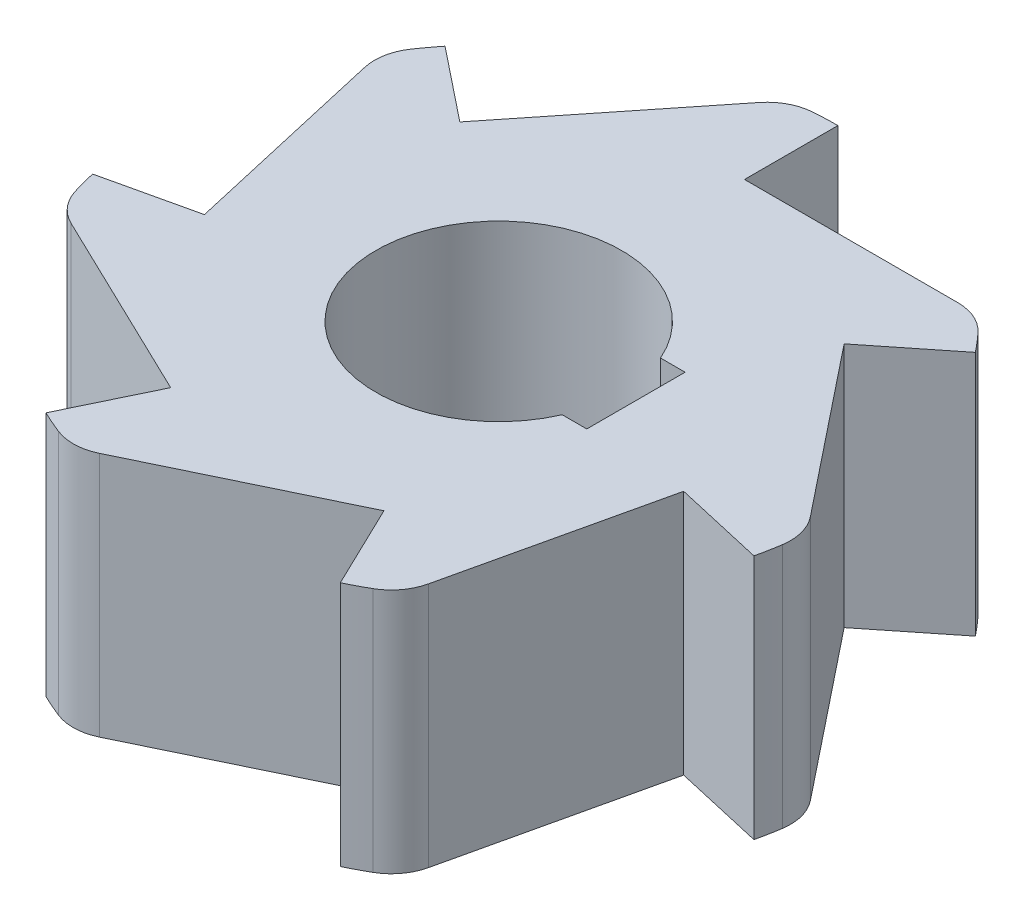
ISO-10303-21;
HEADER;
FILE_DESCRIPTION(('STEP AP214'),'2;1');
FILE_NAME('part.step','',(''),(''),'','','');
FILE_SCHEMA(('AUTOMOTIVE_DESIGN { 1 0 10303 214 1 1 1 1 }'));
ENDSEC;
DATA;
#1=APPLICATION_CONTEXT('core data for automotive mechanical design processes');
#2=APPLICATION_PROTOCOL_DEFINITION('international standard','automotive_design',2000,#1);
#3=PRODUCT_CONTEXT('',#1,'mechanical');
#4=PRODUCT('Part','Part','',(#3));
#5=PRODUCT_RELATED_PRODUCT_CATEGORY('part','',(#4));
#6=PRODUCT_DEFINITION_FORMATION('','',#4);
#7=PRODUCT_DEFINITION_CONTEXT('part definition',#1,'design');
#8=PRODUCT_DEFINITION('design','',#6,#7);
#9=PRODUCT_DEFINITION_SHAPE('','',#8);
#10=(LENGTH_UNIT() NAMED_UNIT(*) SI_UNIT(.MILLI.,.METRE.));
#11=(NAMED_UNIT(*) PLANE_ANGLE_UNIT() SI_UNIT($,.RADIAN.));
#12=(NAMED_UNIT(*) SI_UNIT($,.STERADIAN.) SOLID_ANGLE_UNIT());
#13=UNCERTAINTY_MEASURE_WITH_UNIT(LENGTH_MEASURE(1.E-05),#10,'distance_accuracy_value','');
#14=(GEOMETRIC_REPRESENTATION_CONTEXT(3) GLOBAL_UNCERTAINTY_ASSIGNED_CONTEXT((#13)) GLOBAL_UNIT_ASSIGNED_CONTEXT((#10,
#11,#12)) REPRESENTATION_CONTEXT('',''));
#15=CARTESIAN_POINT('',(0.,0.,0.));
#16=DIRECTION('',(0.,0.,1.));
#17=DIRECTION('',(1.,0.,0.));
#18=AXIS2_PLACEMENT_3D('',#15,#16,#17);
#19=CARTESIAN_POINT('',(21.6941869558779,50.,45.0484433951209));
#20=DIRECTION('',(0.433883739117559,0.,0.900968867902419));
#21=DIRECTION('',(0.900968867902419,0.,-0.433883739117559));
#22=AXIS2_PLACEMENT_3D('',#19,#20,#21);
#23=PLANE('',#22);
#24=DIRECTION('',(-0.900968867902419,0.,0.433883739117559));
#25=VECTOR('',#24,1.);
#26=CARTESIAN_POINT('',(21.6941869558779,0.,45.0484433951209));
#27=LINE('',#26,#25);
#28=CARTESIAN_POINT('',(21.694186955878,0.,45.048443395121));
#29=VERTEX_POINT('',#28);
#30=CARTESIAN_POINT('',(-17.3812805224279,0.,63.8661967507121));
#31=VERTEX_POINT('',#30);
#32=EDGE_CURVE('E306',#29,#31,#27,.T.);
#33=ORIENTED_EDGE('',*,*,#32,.F.);
#34=DIRECTION('',(0.,-1.,0.));
#35=VECTOR('',#34,1.);
#36=CARTESIAN_POINT('',(21.694186955878,50.,45.048443395121));
#37=LINE('',#36,#35);
#38=CARTESIAN_POINT('',(21.694186955878,50.,45.048443395121));
#39=VERTEX_POINT('',#38);
#40=EDGE_CURVE('E11',#39,#29,#37,.T.);
#41=ORIENTED_EDGE('',*,*,#40,.F.);
#42=DIRECTION('',(-0.900968867902419,0.,0.433883739117559));
#43=VECTOR('',#42,1.);
#44=CARTESIAN_POINT('',(21.6941869558779,50.,45.0484433951209));
#45=LINE('',#44,#43);
#46=CARTESIAN_POINT('',(-17.3812805224279,50.,63.8661967507121));
#47=VERTEX_POINT('',#46);
#48=EDGE_CURVE('E519',#39,#47,#45,.T.);
#49=ORIENTED_EDGE('',*,*,#48,.T.);
#50=DIRECTION('',(0.,-1.,0.));
#51=VECTOR('',#50,1.);
#52=CARTESIAN_POINT('',(-17.3812805224279,50.,63.8661967507121));
#53=LINE('',#52,#51);
#54=EDGE_CURVE('E167',#47,#31,#53,.T.);
#55=ORIENTED_EDGE('',*,*,#54,.T.);
#56=EDGE_LOOP('',(#33,#41,#49,#55));
#57=FACE_BOUND('',#56,.T.);
#58=ADVANCED_FACE('F41',(#57),#23,.T.);
#59=CARTESIAN_POINT('',(0.,50.,0.));
#60=DIRECTION('',(-0.900968867902418,0.,0.43388373911756));
#61=DIRECTION('',(0.43388373911756,0.,0.900968867902418));
#62=AXIS2_PLACEMENT_3D('',#59,#60,#61);
#63=PLANE('',#62);
#64=DIRECTION('',(-0.43388373911756,0.,-0.900968867902418));
#65=VECTOR('',#64,1.);
#66=CARTESIAN_POINT('',(0.,0.,0.));
#67=LINE('',#66,#65);
#68=CARTESIAN_POINT('',(29.9379779991117,0.,62.1668518852669));
#69=VERTEX_POINT('',#68);
#70=EDGE_CURVE('E310',#69,#29,#67,.T.);
#71=ORIENTED_EDGE('',*,*,#70,.F.);
#72=DIRECTION('',(0.,-1.,0.));
#73=VECTOR('',#72,1.);
#74=CARTESIAN_POINT('',(29.9379779991117,50.,62.1668518852669));
#75=LINE('',#74,#73);
#76=CARTESIAN_POINT('',(29.9379779991117,50.,62.1668518852669));
#77=VERTEX_POINT('',#76);
#78=EDGE_CURVE('E52',#77,#69,#75,.T.);
#79=ORIENTED_EDGE('',*,*,#78,.F.);
#80=DIRECTION('',(-0.43388373911756,0.,-0.900968867902418));
#81=VECTOR('',#80,1.);
#82=CARTESIAN_POINT('',(0.,50.,0.));
#83=LINE('',#82,#81);
#84=EDGE_CURVE('E529',#77,#39,#83,.T.);
#85=ORIENTED_EDGE('',*,*,#84,.T.);
#86=ORIENTED_EDGE('',*,*,#40,.T.);
#87=EDGE_LOOP('',(#71,#79,#85,#86));
#88=FACE_BOUND('',#87,.T.);
#89=ADVANCED_FACE('F625',(#88),#63,.T.);
#90=CARTESIAN_POINT('',(0.,50.,0.));
#91=DIRECTION('',(0.,-1.,0.));
#92=DIRECTION('',(0.,0.,-1.));
#93=AXIS2_PLACEMENT_3D('',#90,#91,#92);
#94=CYLINDRICAL_SURFACE('',#93,69.);
#95=CARTESIAN_POINT('',(0.,0.,0.));
#96=DIRECTION('',(0.,1.,0.));
#97=DIRECTION('',(0.,0.,1.));
#98=AXIS2_PLACEMENT_3D('',#95,#96,#97);
#99=CIRCLE('',#98,69.);
#100=CARTESIAN_POINT('',(34.3202175931191,0.,59.8591903082639));
#101=VERTEX_POINT('',#100);
#102=EDGE_CURVE('E314',#101,#69,#99,.F.);
#103=ORIENTED_EDGE('',*,*,#102,.F.);
#104=DIRECTION('',(0.,-1.,0.));
#105=VECTOR('',#104,1.);
#106=CARTESIAN_POINT('',(34.3202175931191,50.,59.8591903082639));
#107=LINE('',#106,#105);
#108=CARTESIAN_POINT('',(34.3202175931191,50.,59.8591903082639));
#109=VERTEX_POINT('',#108);
#110=EDGE_CURVE('E484',#109,#101,#107,.T.);
#111=ORIENTED_EDGE('',*,*,#110,.F.);
#112=CARTESIAN_POINT('',(0.,50.,0.));
#113=DIRECTION('',(0.,1.,0.));
#114=DIRECTION('',(0.,0.,1.));
#115=AXIS2_PLACEMENT_3D('',#112,#113,#114);
#116=CIRCLE('',#115,69.);
#117=EDGE_CURVE('E533',#109,#77,#116,.F.);
#118=ORIENTED_EDGE('',*,*,#117,.T.);
#119=ORIENTED_EDGE('',*,*,#78,.T.);
#120=EDGE_LOOP('',(#103,#111,#118,#119));
#121=FACE_BOUND('',#120,.T.);
#122=ADVANCED_FACE('F628',(#121),#94,.T.);
#123=CARTESIAN_POINT('',(29.3462730144062,50.,51.1839453360518));
#124=DIRECTION('',(0.,-1.,0.));
#125=DIRECTION('',(0.,0.,-1.));
#126=AXIS2_PLACEMENT_3D('',#123,#124,#125);
#127=CYLINDRICAL_SURFACE('',#126,10.);
#128=CARTESIAN_POINT('',(29.3462730144062,0.,51.1839453360518));
#129=DIRECTION('',(0.,1.,0.));
#130=DIRECTION('',(0.,0.,1.));
#131=AXIS2_PLACEMENT_3D('',#128,#129,#130);
#132=CIRCLE('',#131,10.);
#133=CARTESIAN_POINT('',(39.0955521362244,0.,53.4091546756149));
#134=VERTEX_POINT('',#133);
#135=EDGE_CURVE('E318',#101,#134,#132,.T.);
#136=ORIENTED_EDGE('',*,*,#135,.T.);
#137=DIRECTION('',(0.,-1.,0.));
#138=VECTOR('',#137,1.);
#139=CARTESIAN_POINT('',(39.0955521362244,50.,53.4091546756149));
#140=LINE('',#139,#138);
#141=CARTESIAN_POINT('',(39.0955521362244,50.,53.4091546756149));
#142=VERTEX_POINT('',#141);
#143=EDGE_CURVE('E481',#142,#134,#140,.T.);
#144=ORIENTED_EDGE('',*,*,#143,.F.);
#145=CARTESIAN_POINT('',(29.3462730144062,50.,51.1839453360518));
#146=DIRECTION('',(0.,1.,0.));
#147=DIRECTION('',(0.,0.,1.));
#148=AXIS2_PLACEMENT_3D('',#145,#146,#147);
#149=CIRCLE('',#148,10.);
#150=EDGE_CURVE('E537',#109,#142,#149,.T.);
#151=ORIENTED_EDGE('',*,*,#150,.F.);
#152=ORIENTED_EDGE('',*,*,#110,.T.);
#153=EDGE_LOOP('',(#136,#144,#151,#152));
#154=FACE_BOUND('',#153,.T.);
#155=ADVANCED_FACE('F634',(#154),#127,.T.);
#156=CARTESIAN_POINT('',(48.7463956090912,50.,11.1260466978157));
#157=DIRECTION('',(0.974927912181824,0.,0.222520933956314));
#158=DIRECTION('',(0.222520933956314,0.,-0.974927912181824));
#159=AXIS2_PLACEMENT_3D('',#156,#157,#158);
#160=PLANE('',#159);
#161=DIRECTION('',(-0.222520933956314,0.,0.974927912181824));
#162=VECTOR('',#161,1.);
#163=CARTESIAN_POINT('',(48.7463956090912,0.,11.1260466978157));
#164=LINE('',#163,#162);
#165=CARTESIAN_POINT('',(48.7463956090912,0.,11.1260466978157));
#166=VERTEX_POINT('',#165);
#167=EDGE_CURVE('E322',#166,#134,#164,.T.);
#168=ORIENTED_EDGE('',*,*,#167,.F.);
#169=DIRECTION('',(0.,-1.,0.));
#170=VECTOR('',#169,1.);
#171=CARTESIAN_POINT('',(48.7463956090912,50.,11.1260466978157));
#172=LINE('',#171,#170);
#173=CARTESIAN_POINT('',(48.7463956090912,50.,11.1260466978157));
#174=VERTEX_POINT('',#173);
#175=EDGE_CURVE('E478',#174,#166,#172,.T.);
#176=ORIENTED_EDGE('',*,*,#175,.F.);
#177=DIRECTION('',(-0.222520933956314,0.,0.974927912181824));
#178=VECTOR('',#177,1.);
#179=CARTESIAN_POINT('',(48.7463956090912,50.,11.1260466978157));
#180=LINE('',#179,#178);
#181=EDGE_CURVE('E540',#174,#142,#180,.T.);
#182=ORIENTED_EDGE('',*,*,#181,.T.);
#183=ORIENTED_EDGE('',*,*,#143,.T.);
#184=EDGE_LOOP('',(#168,#176,#182,#183));
#185=FACE_BOUND('',#184,.T.);
#186=ADVANCED_FACE('F638',(#185),#160,.T.);
#187=CARTESIAN_POINT('',(0.,50.,0.));
#188=DIRECTION('',(-0.222520933956315,0.,0.974927912181824));
#189=DIRECTION('',(0.974927912181824,0.,0.222520933956315));
#190=AXIS2_PLACEMENT_3D('',#187,#188,#189);
#191=PLANE('',#190);
#192=DIRECTION('',(-0.974927912181824,0.,-0.222520933956315));
#193=VECTOR('',#192,1.);
#194=CARTESIAN_POINT('',(0.,0.,0.));
#195=LINE('',#194,#193);
#196=CARTESIAN_POINT('',(67.2700259405458,0.,15.3539444429857));
#197=VERTEX_POINT('',#196);
#198=EDGE_CURVE('E326',#197,#166,#195,.T.);
#199=ORIENTED_EDGE('',*,*,#198,.F.);
#200=DIRECTION('',(0.,-1.,0.));
#201=VECTOR('',#200,1.);
#202=CARTESIAN_POINT('',(67.2700259405458,50.,15.3539444429857));
#203=LINE('',#202,#201);
#204=CARTESIAN_POINT('',(67.2700259405458,50.,15.3539444429857));
#205=VERTEX_POINT('',#204);
#206=EDGE_CURVE('E475',#205,#197,#203,.T.);
#207=ORIENTED_EDGE('',*,*,#206,.F.);
#208=DIRECTION('',(-0.974927912181824,0.,-0.222520933956315));
#209=VECTOR('',#208,1.);
#210=CARTESIAN_POINT('',(0.,50.,0.));
#211=LINE('',#210,#209);
#212=EDGE_CURVE('E544',#205,#174,#211,.T.);
#213=ORIENTED_EDGE('',*,*,#212,.T.);
#214=ORIENTED_EDGE('',*,*,#175,.T.);
#215=EDGE_LOOP('',(#199,#207,#213,#214));
#216=FACE_BOUND('',#215,.T.);
#217=ADVANCED_FACE('F641',(#216),#191,.T.);
#218=CARTESIAN_POINT('',(0.,50.,0.));
#219=DIRECTION('',(0.,-1.,0.));
#220=DIRECTION('',(0.,0.,-1.));
#221=AXIS2_PLACEMENT_3D('',#218,#219,#220);
#222=CYLINDRICAL_SURFACE('',#221,69.);
#223=CARTESIAN_POINT('',(0.,0.,0.));
#224=DIRECTION('',(0.,1.,0.));
#225=DIRECTION('',(0.,0.,1.));
#226=AXIS2_PLACEMENT_3D('',#223,#224,#225);
#227=CIRCLE('',#226,69.);
#228=CARTESIAN_POINT('',(68.1981051649284,0.,10.48896810527));
#229=VERTEX_POINT('',#228);
#230=EDGE_CURVE('E330',#229,#197,#227,.F.);
#231=ORIENTED_EDGE('',*,*,#230,.F.);
#232=DIRECTION('',(0.,-1.,0.));
#233=VECTOR('',#232,1.);
#234=CARTESIAN_POINT('',(68.1981051649284,50.,10.48896810527));
#235=LINE('',#234,#233);
#236=CARTESIAN_POINT('',(68.1981051649284,50.,10.48896810527));
#237=VERTEX_POINT('',#236);
#238=EDGE_CURVE('E472',#237,#229,#235,.T.);
#239=ORIENTED_EDGE('',*,*,#238,.F.);
#240=CARTESIAN_POINT('',(0.,50.,0.));
#241=DIRECTION('',(0.,1.,0.));
#242=DIRECTION('',(0.,0.,1.));
#243=AXIS2_PLACEMENT_3D('',#240,#241,#242);
#244=CIRCLE('',#243,69.);
#245=EDGE_CURVE('E548',#237,#205,#244,.F.);
#246=ORIENTED_EDGE('',*,*,#245,.T.);
#247=ORIENTED_EDGE('',*,*,#206,.T.);
#248=EDGE_LOOP('',(#231,#239,#246,#247));
#249=FACE_BOUND('',#248,.T.);
#250=ADVANCED_FACE('F645',(#249),#222,.T.);
#251=CARTESIAN_POINT('',(58.3143218076924,50.,8.96882780015844));
#252=DIRECTION('',(0.,-1.,0.));
#253=DIRECTION('',(0.,0.,-1.));
#254=AXIS2_PLACEMENT_3D('',#251,#252,#253);
#255=CYLINDRICAL_SURFACE('',#254,10.);
#256=CARTESIAN_POINT('',(58.3143218076924,0.,8.96882780015844));
#257=DIRECTION('',(0.,1.,0.));
#258=DIRECTION('',(0.,0.,1.));
#259=AXIS2_PLACEMENT_3D('',#256,#257,#258);
#260=CIRCLE('',#259,10.);
#261=CARTESIAN_POINT('',(66.1326366323727,0.,2.73392978157109));
#262=VERTEX_POINT('',#261);
#263=EDGE_CURVE('E334',#229,#262,#260,.T.);
#264=ORIENTED_EDGE('',*,*,#263,.T.);
#265=DIRECTION('',(0.,-1.,0.));
#266=VECTOR('',#265,1.);
#267=CARTESIAN_POINT('',(66.1326366323727,50.,2.73392978157109));
#268=LINE('',#267,#266);
#269=CARTESIAN_POINT('',(66.1326366323727,50.,2.73392978157109));
#270=VERTEX_POINT('',#269);
#271=EDGE_CURVE('E469',#270,#262,#268,.T.);
#272=ORIENTED_EDGE('',*,*,#271,.F.);
#273=CARTESIAN_POINT('',(58.3143218076924,50.,8.96882780015844));
#274=DIRECTION('',(0.,1.,0.));
#275=DIRECTION('',(0.,0.,1.));
#276=AXIS2_PLACEMENT_3D('',#273,#274,#275);
#277=CIRCLE('',#276,10.);
#278=EDGE_CURVE('E552',#237,#270,#277,.T.);
#279=ORIENTED_EDGE('',*,*,#278,.F.);
#280=ORIENTED_EDGE('',*,*,#238,.T.);
#281=EDGE_LOOP('',(#264,#272,#279,#280));
#282=FACE_BOUND('',#281,.T.);
#283=ADVANCED_FACE('F650',(#282),#255,.T.);
#284=CARTESIAN_POINT('',(39.0915741234015,50.,-31.1744900929367));
#285=DIRECTION('',(0.78183148246803,0.,-0.623489801858734));
#286=DIRECTION('',(-0.623489801858734,0.,-0.78183148246803));
#287=AXIS2_PLACEMENT_3D('',#284,#285,#286);
#288=PLANE('',#287);
#289=DIRECTION('',(0.623489801858734,0.,0.78183148246803));
#290=VECTOR('',#289,1.);
#291=CARTESIAN_POINT('',(39.0915741234015,0.,-31.1744900929367));
#292=LINE('',#291,#290);
#293=CARTESIAN_POINT('',(39.0915741234015,0.,-31.1744900929367));
#294=VERTEX_POINT('',#293);
#295=EDGE_CURVE('E338',#294,#262,#292,.T.);
#296=ORIENTED_EDGE('',*,*,#295,.F.);
#297=DIRECTION('',(0.,-1.,0.));
#298=VECTOR('',#297,1.);
#299=CARTESIAN_POINT('',(39.0915741234015,50.,-31.1744900929367));
#300=LINE('',#299,#298);
#301=CARTESIAN_POINT('',(39.0915741234015,50.,-31.1744900929367));
#302=VERTEX_POINT('',#301);
#303=EDGE_CURVE('E466',#302,#294,#300,.T.);
#304=ORIENTED_EDGE('',*,*,#303,.F.);
#305=DIRECTION('',(0.623489801858734,0.,0.78183148246803));
#306=VECTOR('',#305,1.);
#307=CARTESIAN_POINT('',(39.0915741234015,50.,-31.1744900929367));
#308=LINE('',#307,#306);
#309=EDGE_CURVE('E555',#302,#270,#308,.T.);
#310=ORIENTED_EDGE('',*,*,#309,.T.);
#311=ORIENTED_EDGE('',*,*,#271,.T.);
#312=EDGE_LOOP('',(#296,#304,#310,#311));
#313=FACE_BOUND('',#312,.T.);
#314=ADVANCED_FACE('F987',(#313),#288,.T.);
#315=CARTESIAN_POINT('',(0.,50.,0.));
#316=DIRECTION('',(0.623489801858733,0.,0.78183148246803));
#317=DIRECTION('',(0.78183148246803,0.,-0.623489801858733));
#318=AXIS2_PLACEMENT_3D('',#315,#316,#317);
#319=PLANE('',#318);
#320=DIRECTION('',(-0.78183148246803,0.,0.623489801858733));
#321=VECTOR('',#320,1.);
#322=CARTESIAN_POINT('',(0.,0.,0.));
#323=LINE('',#322,#321);
#324=CARTESIAN_POINT('',(53.9463722902941,0.,-43.0207963282526));
#325=VERTEX_POINT('',#324);
#326=EDGE_CURVE('E342',#325,#294,#323,.T.);
#327=ORIENTED_EDGE('',*,*,#326,.F.);
#328=DIRECTION('',(0.,-1.,0.));
#329=VECTOR('',#328,1.);
#330=CARTESIAN_POINT('',(53.9463722902941,50.,-43.0207963282526));
#331=LINE('',#330,#329);
#332=CARTESIAN_POINT('',(53.9463722902941,50.,-43.0207963282526));
#333=VERTEX_POINT('',#332);
#334=EDGE_CURVE('E463',#333,#325,#331,.T.);
#335=ORIENTED_EDGE('',*,*,#334,.F.);
#336=DIRECTION('',(-0.78183148246803,0.,0.623489801858733));
#337=VECTOR('',#336,1.);
#338=CARTESIAN_POINT('',(0.,50.,0.));
#339=LINE('',#338,#337);
#340=EDGE_CURVE('E559',#333,#302,#339,.T.);
#341=ORIENTED_EDGE('',*,*,#340,.T.);
#342=ORIENTED_EDGE('',*,*,#303,.T.);
#343=EDGE_LOOP('',(#327,#335,#341,#342));
#344=FACE_BOUND('',#343,.T.);
#345=ADVANCED_FACE('F657',(#344),#319,.T.);
#346=CARTESIAN_POINT('',(0.,50.,0.));
#347=DIRECTION('',(0.,-1.,0.));
#348=DIRECTION('',(0.,0.,-1.));
#349=AXIS2_PLACEMENT_3D('',#346,#347,#348);
#350=CYLINDRICAL_SURFACE('',#349,69.);
#351=CARTESIAN_POINT('',(0.,0.,0.));
#352=DIRECTION('',(0.,1.,0.));
#353=DIRECTION('',(0.,0.,1.));
#354=AXIS2_PLACEMENT_3D('',#351,#352,#353);
#355=CIRCLE('',#354,69.);
#356=CARTESIAN_POINT('',(50.7214285597254,0.,-46.7796610169492));
#357=VERTEX_POINT('',#356);
#358=EDGE_CURVE('E346',#357,#325,#355,.F.);
#359=ORIENTED_EDGE('',*,*,#358,.F.);
#360=DIRECTION('',(0.,-1.,0.));
#361=VECTOR('',#360,1.);
#362=CARTESIAN_POINT('',(50.7214285597254,50.,-46.7796610169492));
#363=LINE('',#362,#361);
#364=CARTESIAN_POINT('',(50.7214285597254,50.,-46.7796610169492));
#365=VERTEX_POINT('',#364);
#366=EDGE_CURVE('E460',#365,#357,#363,.T.);
#367=ORIENTED_EDGE('',*,*,#366,.F.);
#368=CARTESIAN_POINT('',(0.,50.,0.));
#369=DIRECTION('',(0.,1.,0.));
#370=DIRECTION('',(0.,0.,1.));
#371=AXIS2_PLACEMENT_3D('',#368,#369,#370);
#372=CIRCLE('',#371,69.);
#373=EDGE_CURVE('E563',#365,#333,#372,.F.);
#374=ORIENTED_EDGE('',*,*,#373,.T.);
#375=ORIENTED_EDGE('',*,*,#334,.T.);
#376=EDGE_LOOP('',(#359,#367,#374,#375));
#377=FACE_BOUND('',#376,.T.);
#378=ADVANCED_FACE('F661',(#377),#350,.T.);
#379=CARTESIAN_POINT('',(43.3704968844029,50.,-40.));
#380=DIRECTION('',(0.,-1.,0.));
#381=DIRECTION('',(0.,0.,-1.));
#382=AXIS2_PLACEMENT_3D('',#379,#380,#381);
#383=CYLINDRICAL_SURFACE('',#382,10.);
#384=CARTESIAN_POINT('',(43.3704968844029,0.,-40.));
#385=DIRECTION('',(0.,1.,0.));
#386=DIRECTION('',(0.,0.,1.));
#387=AXIS2_PLACEMENT_3D('',#384,#385,#386);
#388=CIRCLE('',#387,10.);
#389=CARTESIAN_POINT('',(43.3704968844029,0.,-50.));
#390=VERTEX_POINT('',#389);
#391=EDGE_CURVE('E350',#357,#390,#388,.T.);
#392=ORIENTED_EDGE('',*,*,#391,.T.);
#393=DIRECTION('',(0.,-1.,0.));
#394=VECTOR('',#393,1.);
#395=CARTESIAN_POINT('',(43.3704968844029,50.,-50.));
#396=LINE('',#395,#394);
#397=CARTESIAN_POINT('',(43.3704968844029,50.,-50.));
#398=VERTEX_POINT('',#397);
#399=EDGE_CURVE('E457',#398,#390,#396,.T.);
#400=ORIENTED_EDGE('',*,*,#399,.F.);
#401=CARTESIAN_POINT('',(43.3704968844029,50.,-40.));
#402=DIRECTION('',(0.,1.,0.));
#403=DIRECTION('',(0.,0.,1.));
#404=AXIS2_PLACEMENT_3D('',#401,#402,#403);
#405=CIRCLE('',#404,10.);
#406=EDGE_CURVE('E567',#365,#398,#405,.T.);
#407=ORIENTED_EDGE('',*,*,#406,.F.);
#408=ORIENTED_EDGE('',*,*,#366,.T.);
#409=EDGE_LOOP('',(#392,#400,#407,#408));
#410=FACE_BOUND('',#409,.T.);
#411=ADVANCED_FACE('F667',(#410),#383,.T.);
#412=CARTESIAN_POINT('',(0.,50.,-50.));
#413=DIRECTION('',(0.,0.,-1.));
#414=DIRECTION('',(-1.,0.,0.));
#415=AXIS2_PLACEMENT_3D('',#412,#413,#414);
#416=PLANE('',#415);
#417=DIRECTION('',(1.,0.,0.));
#418=VECTOR('',#417,1.);
#419=CARTESIAN_POINT('',(0.,0.,-50.));
#420=LINE('',#419,#418);
#421=CARTESIAN_POINT('',(0.,0.,-50.));
#422=VERTEX_POINT('',#421);
#423=EDGE_CURVE('E354',#422,#390,#420,.T.);
#424=ORIENTED_EDGE('',*,*,#423,.F.);
#425=DIRECTION('',(0.,-1.,0.));
#426=VECTOR('',#425,1.);
#427=CARTESIAN_POINT('',(0.,50.,-50.));
#428=LINE('',#427,#426);
#429=CARTESIAN_POINT('',(0.,50.,-50.));
#430=VERTEX_POINT('',#429);
#431=EDGE_CURVE('E454',#430,#422,#428,.T.);
#432=ORIENTED_EDGE('',*,*,#431,.F.);
#433=DIRECTION('',(1.,0.,0.));
#434=VECTOR('',#433,1.);
#435=CARTESIAN_POINT('',(0.,50.,-50.));
#436=LINE('',#435,#434);
#437=EDGE_CURVE('E570',#430,#398,#436,.T.);
#438=ORIENTED_EDGE('',*,*,#437,.T.);
#439=ORIENTED_EDGE('',*,*,#399,.T.);
#440=EDGE_LOOP('',(#424,#432,#438,#439));
#441=FACE_BOUND('',#440,.T.);
#442=ADVANCED_FACE('F671',(#441),#416,.T.);
#443=CARTESIAN_POINT('',(0.,50.,0.));
#444=DIRECTION('',(1.,0.,0.));
#445=DIRECTION('',(0.,0.,-1.));
#446=AXIS2_PLACEMENT_3D('',#443,#444,#445);
#447=PLANE('',#446);
#448=DIRECTION('',(0.,0.,1.));
#449=VECTOR('',#448,1.);
#450=CARTESIAN_POINT('',(0.,0.,0.));
#451=LINE('',#450,#449);
#452=CARTESIAN_POINT('',(-1.85213686511041E-12,0.,-69.));
#453=VERTEX_POINT('',#452);
#454=EDGE_CURVE('E358',#453,#422,#451,.T.);
#455=ORIENTED_EDGE('',*,*,#454,.F.);
#456=DIRECTION('',(0.,-1.,0.));
#457=VECTOR('',#456,1.);
#458=CARTESIAN_POINT('',(-1.85213686511041E-12,50.,-69.));
#459=LINE('',#458,#457);
#460=CARTESIAN_POINT('',(-1.85213686511041E-12,50.,-69.));
#461=VERTEX_POINT('',#460);
#462=EDGE_CURVE('E451',#461,#453,#459,.T.);
#463=ORIENTED_EDGE('',*,*,#462,.F.);
#464=DIRECTION('',(0.,0.,1.));
#465=VECTOR('',#464,1.);
#466=CARTESIAN_POINT('',(0.,50.,0.));
#467=LINE('',#466,#465);
#468=EDGE_CURVE('E574',#461,#430,#467,.T.);
#469=ORIENTED_EDGE('',*,*,#468,.T.);
#470=ORIENTED_EDGE('',*,*,#431,.T.);
#471=EDGE_LOOP('',(#455,#463,#469,#470));
#472=FACE_BOUND('',#471,.T.);
#473=ADVANCED_FACE('F674',(#472),#447,.T.);
#474=CARTESIAN_POINT('',(0.,50.,0.));
#475=DIRECTION('',(0.,-1.,0.));
#476=DIRECTION('',(0.,0.,-1.));
#477=AXIS2_PLACEMENT_3D('',#474,#475,#476);
#478=CYLINDRICAL_SURFACE('',#477,69.);
#479=CARTESIAN_POINT('',(0.,0.,0.));
#480=DIRECTION('',(0.,1.,0.));
#481=DIRECTION('',(0.,0.,1.));
#482=AXIS2_PLACEMENT_3D('',#479,#480,#481);
#483=CIRCLE('',#482,69.);
#484=CARTESIAN_POINT('',(-4.94951827953817,0.,-68.8222512622227));
#485=VERTEX_POINT('',#484);
#486=EDGE_CURVE('E362',#485,#453,#483,.F.);
#487=ORIENTED_EDGE('',*,*,#486,.F.);
#488=DIRECTION('',(0.,-1.,0.));
#489=VECTOR('',#488,1.);
#490=CARTESIAN_POINT('',(-4.94951827953817,50.,-68.8222512622227));
#491=LINE('',#490,#489);
#492=CARTESIAN_POINT('',(-4.94951827953817,50.,-68.8222512622227));
#493=VERTEX_POINT('',#492);
#494=EDGE_CURVE('E448',#493,#485,#491,.T.);
#495=ORIENTED_EDGE('',*,*,#494,.F.);
#496=CARTESIAN_POINT('',(0.,50.,0.));
#497=DIRECTION('',(0.,1.,0.));
#498=DIRECTION('',(0.,0.,1.));
#499=AXIS2_PLACEMENT_3D('',#496,#497,#498);
#500=CIRCLE('',#499,69.);
#501=EDGE_CURVE('E578',#493,#461,#500,.F.);
#502=ORIENTED_EDGE('',*,*,#501,.T.);
#503=ORIENTED_EDGE('',*,*,#462,.T.);
#504=EDGE_LOOP('',(#487,#495,#502,#503));
#505=FACE_BOUND('',#504,.T.);
#506=ADVANCED_FACE('F678',(#505),#478,.T.);
#507=CARTESIAN_POINT('',(-4.23219678975003,50.,-58.8480119488571));
#508=DIRECTION('',(0.,-1.,0.));
#509=DIRECTION('',(0.,0.,-1.));
#510=AXIS2_PLACEMENT_3D('',#507,#508,#509);
#511=CYLINDRICAL_SURFACE('',#510,10.);
#512=CARTESIAN_POINT('',(-4.23219678975003,0.,-58.8480119488571));
#513=DIRECTION('',(0.,1.,0.));
#514=DIRECTION('',(0.,0.,1.));
#515=AXIS2_PLACEMENT_3D('',#512,#513,#514);
#516=CIRCLE('',#515,10.);
#517=CARTESIAN_POINT('',(-12.0505116144303,0.,-65.0829099674445));
#518=VERTEX_POINT('',#517);
#519=EDGE_CURVE('E366',#485,#518,#516,.T.);
#520=ORIENTED_EDGE('',*,*,#519,.T.);
#521=DIRECTION('',(0.,-1.,0.));
#522=VECTOR('',#521,1.);
#523=CARTESIAN_POINT('',(-12.0505116144303,50.,-65.0829099674445));
#524=LINE('',#523,#522);
#525=CARTESIAN_POINT('',(-12.0505116144303,50.,-65.0829099674445));
#526=VERTEX_POINT('',#525);
#527=EDGE_CURVE('E445',#526,#518,#524,.T.);
#528=ORIENTED_EDGE('',*,*,#527,.F.);
#529=CARTESIAN_POINT('',(-4.23219678975003,50.,-58.8480119488571));
#530=DIRECTION('',(0.,1.,0.));
#531=DIRECTION('',(0.,0.,1.));
#532=AXIS2_PLACEMENT_3D('',#529,#530,#531);
#533=CIRCLE('',#532,10.);
#534=EDGE_CURVE('E582',#493,#526,#533,.T.);
#535=ORIENTED_EDGE('',*,*,#534,.F.);
#536=ORIENTED_EDGE('',*,*,#494,.T.);
#537=EDGE_LOOP('',(#520,#528,#535,#536));
#538=FACE_BOUND('',#537,.T.);
#539=ADVANCED_FACE('F683',(#538),#511,.T.);
#540=CARTESIAN_POINT('',(-39.0915741234015,50.,-31.1744900929367));
#541=DIRECTION('',(-0.78183148246803,0.,-0.623489801858733));
#542=DIRECTION('',(-0.623489801858733,0.,0.78183148246803));
#543=AXIS2_PLACEMENT_3D('',#540,#541,#542);
#544=PLANE('',#543);
#545=DIRECTION('',(0.623489801858733,0.,-0.78183148246803));
#546=VECTOR('',#545,1.);
#547=CARTESIAN_POINT('',(-39.0915741234015,0.,-31.1744900929367));
#548=LINE('',#547,#546);
#549=CARTESIAN_POINT('',(-39.0915741234015,0.,-31.1744900929354));
#550=VERTEX_POINT('',#549);
#551=EDGE_CURVE('E370',#550,#518,#548,.T.);
#552=ORIENTED_EDGE('',*,*,#551,.F.);
#553=DIRECTION('',(0.,-1.,0.));
#554=VECTOR('',#553,1.);
#555=CARTESIAN_POINT('',(-39.0915741234015,50.,-31.1744900929354));
#556=LINE('',#555,#554);
#557=CARTESIAN_POINT('',(-39.0915741234015,50.,-31.1744900929354));
#558=VERTEX_POINT('',#557);
#559=EDGE_CURVE('E442',#558,#550,#556,.T.);
#560=ORIENTED_EDGE('',*,*,#559,.F.);
#561=DIRECTION('',(0.623489801858733,0.,-0.78183148246803));
#562=VECTOR('',#561,1.);
#563=CARTESIAN_POINT('',(-39.0915741234015,50.,-31.1744900929367));
#564=LINE('',#563,#562);
#565=EDGE_CURVE('E585',#558,#526,#564,.T.);
#566=ORIENTED_EDGE('',*,*,#565,.T.);
#567=ORIENTED_EDGE('',*,*,#527,.T.);
#568=EDGE_LOOP('',(#552,#560,#566,#567));
#569=FACE_BOUND('',#568,.T.);
#570=ADVANCED_FACE('F715',(#569),#544,.T.);
#571=CARTESIAN_POINT('',(0.,50.,0.));
#572=DIRECTION('',(0.623489801858718,0.,-0.781831482468042));
#573=DIRECTION('',(-0.781831482468042,0.,-0.623489801858718));
#574=AXIS2_PLACEMENT_3D('',#571,#572,#573);
#575=PLANE('',#574);
#576=DIRECTION('',(0.781831482468042,0.,0.623489801858718));
#577=VECTOR('',#576,1.);
#578=CARTESIAN_POINT('',(0.,0.,0.));
#579=LINE('',#578,#577);
#580=CARTESIAN_POINT('',(-53.9463722902941,0.,-43.0207963282509));
#581=VERTEX_POINT('',#580);
#582=EDGE_CURVE('E374',#581,#550,#579,.T.);
#583=ORIENTED_EDGE('',*,*,#582,.F.);
#584=DIRECTION('',(0.,-1.,0.));
#585=VECTOR('',#584,1.);
#586=CARTESIAN_POINT('',(-53.9463722902941,50.,-43.0207963282509));
#587=LINE('',#586,#585);
#588=CARTESIAN_POINT('',(-53.9463722902941,50.,-43.0207963282509));
#589=VERTEX_POINT('',#588);
#590=EDGE_CURVE('E439',#589,#581,#587,.T.);
#591=ORIENTED_EDGE('',*,*,#590,.F.);
#592=DIRECTION('',(0.781831482468042,0.,0.623489801858718));
#593=VECTOR('',#592,1.);
#594=CARTESIAN_POINT('',(0.,50.,0.));
#595=LINE('',#594,#593);
#596=EDGE_CURVE('E589',#589,#558,#595,.T.);
#597=ORIENTED_EDGE('',*,*,#596,.T.);
#598=ORIENTED_EDGE('',*,*,#559,.T.);
#599=EDGE_LOOP('',(#583,#591,#597,#598));
#600=FACE_BOUND('',#599,.T.);
#601=ADVANCED_FACE('F690',(#600),#575,.T.);
#602=CARTESIAN_POINT('',(0.,50.,0.));
#603=DIRECTION('',(0.,-1.,0.));
#604=DIRECTION('',(0.,0.,-1.));
#605=AXIS2_PLACEMENT_3D('',#602,#603,#604);
#606=CYLINDRICAL_SURFACE('',#605,69.);
#607=CARTESIAN_POINT('',(0.,0.,0.));
#608=DIRECTION('',(0.,1.,0.));
#609=DIRECTION('',(0.,0.,1.));
#610=AXIS2_PLACEMENT_3D('',#607,#608,#609);
#611=CIRCLE('',#610,69.);
#612=CARTESIAN_POINT('',(-56.8933769025363,0.,-39.0402825889613));
#613=VERTEX_POINT('',#612);
#614=EDGE_CURVE('E378',#613,#581,#611,.F.);
#615=ORIENTED_EDGE('',*,*,#614,.F.);
#616=DIRECTION('',(0.,-1.,0.));
#617=VECTOR('',#616,1.);
#618=CARTESIAN_POINT('',(-56.8933769025363,50.,-39.0402825889613));
#619=LINE('',#618,#617);
#620=CARTESIAN_POINT('',(-56.8933769025363,50.,-39.0402825889613));
#621=VERTEX_POINT('',#620);
#622=EDGE_CURVE('E436',#621,#613,#619,.T.);
#623=ORIENTED_EDGE('',*,*,#622,.F.);
#624=CARTESIAN_POINT('',(0.,50.,0.));
#625=DIRECTION('',(0.,1.,0.));
#626=DIRECTION('',(0.,0.,1.));
#627=AXIS2_PLACEMENT_3D('',#624,#625,#626);
#628=CIRCLE('',#627,69.);
#629=EDGE_CURVE('E593',#621,#589,#628,.F.);
#630=ORIENTED_EDGE('',*,*,#629,.T.);
#631=ORIENTED_EDGE('',*,*,#590,.T.);
#632=EDGE_LOOP('',(#615,#623,#630,#631));
#633=FACE_BOUND('',#632,.T.);
#634=ADVANCED_FACE('F694',(#633),#606,.T.);
#635=CARTESIAN_POINT('',(-48.6479599601397,50.,-33.3822706195466));
#636=DIRECTION('',(0.,-1.,0.));
#637=DIRECTION('',(0.,0.,-1.));
#638=AXIS2_PLACEMENT_3D('',#635,#636,#637);
#639=CYLINDRICAL_SURFACE('',#638,10.);
#640=CARTESIAN_POINT('',(-48.6479599601397,0.,-33.3822706195466));
#641=DIRECTION('',(0.,1.,0.));
#642=DIRECTION('',(0.,0.,1.));
#643=AXIS2_PLACEMENT_3D('',#640,#641,#642);
#644=CIRCLE('',#643,10.);
#645=CARTESIAN_POINT('',(-58.3972390819579,0.,-31.1570612799835));
#646=VERTEX_POINT('',#645);
#647=EDGE_CURVE('E382',#613,#646,#644,.T.);
#648=ORIENTED_EDGE('',*,*,#647,.T.);
#649=DIRECTION('',(0.,-1.,0.));
#650=VECTOR('',#649,1.);
#651=CARTESIAN_POINT('',(-58.3972390819579,50.,-31.1570612799835));
#652=LINE('',#651,#650);
#653=CARTESIAN_POINT('',(-58.3972390819579,50.,-31.1570612799835));
#654=VERTEX_POINT('',#653);
#655=EDGE_CURVE('E433',#654,#646,#652,.T.);
#656=ORIENTED_EDGE('',*,*,#655,.F.);
#657=CARTESIAN_POINT('',(-48.6479599601397,50.,-33.3822706195466));
#658=DIRECTION('',(0.,1.,0.));
#659=DIRECTION('',(0.,0.,1.));
#660=AXIS2_PLACEMENT_3D('',#657,#658,#659);
#661=CIRCLE('',#660,10.);
#662=EDGE_CURVE('E597',#621,#654,#661,.T.);
#663=ORIENTED_EDGE('',*,*,#662,.F.);
#664=ORIENTED_EDGE('',*,*,#622,.T.);
#665=EDGE_LOOP('',(#648,#656,#663,#664));
#666=FACE_BOUND('',#665,.T.);
#667=ADVANCED_FACE('F700',(#666),#639,.T.);
#668=CARTESIAN_POINT('',(-48.7463956090912,50.,11.1260466978157));
#669=DIRECTION('',(-0.974927912181824,0.,0.222520933956315));
#670=DIRECTION('',(0.222520933956315,0.,0.974927912181824));
#671=AXIS2_PLACEMENT_3D('',#668,#669,#670);
#672=PLANE('',#671);
#673=DIRECTION('',(-0.222520933956315,0.,-0.974927912181824));
#674=VECTOR('',#673,1.);
#675=CARTESIAN_POINT('',(-48.7463956090912,0.,11.1260466978157));
#676=LINE('',#675,#674);
#677=CARTESIAN_POINT('',(-48.7463956090912,0.,11.1260466978157));
#678=VERTEX_POINT('',#677);
#679=EDGE_CURVE('E386',#678,#646,#676,.T.);
#680=ORIENTED_EDGE('',*,*,#679,.F.);
#681=DIRECTION('',(0.,-1.,0.));
#682=VECTOR('',#681,1.);
#683=CARTESIAN_POINT('',(-48.7463956090912,50.,11.1260466978157));
#684=LINE('',#683,#682);
#685=CARTESIAN_POINT('',(-48.7463956090912,50.,11.1260466978157));
#686=VERTEX_POINT('',#685);
#687=EDGE_CURVE('E430',#686,#678,#684,.T.);
#688=ORIENTED_EDGE('',*,*,#687,.F.);
#689=DIRECTION('',(-0.222520933956315,0.,-0.974927912181824));
#690=VECTOR('',#689,1.);
#691=CARTESIAN_POINT('',(-48.7463956090912,50.,11.1260466978157));
#692=LINE('',#691,#690);
#693=EDGE_CURVE('E600',#686,#654,#692,.T.);
#694=ORIENTED_EDGE('',*,*,#693,.T.);
#695=ORIENTED_EDGE('',*,*,#655,.T.);
#696=EDGE_LOOP('',(#680,#688,#694,#695));
#697=FACE_BOUND('',#696,.T.);
#698=ADVANCED_FACE('F704',(#697),#672,.T.);
#699=CARTESIAN_POINT('',(0.,50.,0.));
#700=DIRECTION('',(-0.222520933956314,0.,-0.974927912181824));
#701=DIRECTION('',(-0.974927912181824,0.,0.222520933956314));
#702=AXIS2_PLACEMENT_3D('',#699,#700,#701);
#703=PLANE('',#702);
#704=DIRECTION('',(0.974927912181824,0.,-0.222520933956314));
#705=VECTOR('',#704,1.);
#706=CARTESIAN_POINT('',(0.,0.,0.));
#707=LINE('',#706,#705);
#708=CARTESIAN_POINT('',(-67.2700259405458,0.,15.3539444429857));
#709=VERTEX_POINT('',#708);
#710=EDGE_CURVE('E390',#709,#678,#707,.T.);
#711=ORIENTED_EDGE('',*,*,#710,.F.);
#712=DIRECTION('',(0.,-1.,0.));
#713=VECTOR('',#712,1.);
#714=CARTESIAN_POINT('',(-67.2700259405458,50.,15.3539444429857));
#715=LINE('',#714,#713);
#716=CARTESIAN_POINT('',(-67.2700259405458,50.,15.3539444429857));
#717=VERTEX_POINT('',#716);
#718=EDGE_CURVE('E427',#717,#709,#715,.T.);
#719=ORIENTED_EDGE('',*,*,#718,.F.);
#720=DIRECTION('',(0.974927912181824,0.,-0.222520933956314));
#721=VECTOR('',#720,1.);
#722=CARTESIAN_POINT('',(0.,50.,0.));
#723=LINE('',#722,#721);
#724=EDGE_CURVE('E604',#717,#686,#723,.T.);
#725=ORIENTED_EDGE('',*,*,#724,.T.);
#726=ORIENTED_EDGE('',*,*,#687,.T.);
#727=EDGE_LOOP('',(#711,#719,#725,#726));
#728=FACE_BOUND('',#727,.T.);
#729=ADVANCED_FACE('F707',(#728),#703,.T.);
#730=CARTESIAN_POINT('',(0.,50.,0.));
#731=DIRECTION('',(0.,-1.,0.));
#732=DIRECTION('',(0.,0.,-1.));
#733=AXIS2_PLACEMENT_3D('',#730,#731,#732);
#734=CYLINDRICAL_SURFACE('',#733,69.);
#735=CARTESIAN_POINT('',(0.,0.,0.));
#736=DIRECTION('',(0.,1.,0.));
#737=DIRECTION('',(0.,0.,1.));
#738=AXIS2_PLACEMENT_3D('',#735,#736,#737);
#739=CIRCLE('',#738,69.);
#740=CARTESIAN_POINT('',(-65.995362304535,0.,20.1398151504219));
#741=VERTEX_POINT('',#740);
#742=EDGE_CURVE('E394',#741,#709,#739,.F.);
#743=ORIENTED_EDGE('',*,*,#742,.F.);
#744=DIRECTION('',(0.,-1.,0.));
#745=VECTOR('',#744,1.);
#746=CARTESIAN_POINT('',(-65.995362304535,50.,20.1398151504219));
#747=LINE('',#746,#745);
#748=CARTESIAN_POINT('',(-65.995362304535,50.,20.1398151504219));
#749=VERTEX_POINT('',#748);
#750=EDGE_CURVE('E424',#749,#741,#747,.T.);
#751=ORIENTED_EDGE('',*,*,#750,.F.);
#752=CARTESIAN_POINT('',(0.,50.,0.));
#753=DIRECTION('',(0.,1.,0.));
#754=DIRECTION('',(0.,0.,1.));
#755=AXIS2_PLACEMENT_3D('',#752,#753,#754);
#756=CIRCLE('',#755,69.);
#757=EDGE_CURVE('E608',#749,#717,#756,.F.);
#758=ORIENTED_EDGE('',*,*,#757,.T.);
#759=ORIENTED_EDGE('',*,*,#718,.T.);
#760=EDGE_LOOP('',(#743,#751,#758,#759));
#761=FACE_BOUND('',#760,.T.);
#762=ADVANCED_FACE('F711',(#761),#734,.T.);
#763=CARTESIAN_POINT('',(-56.4308170430082,50.,17.2210013605056));
#764=DIRECTION('',(0.,-1.,0.));
#765=DIRECTION('',(0.,0.,-1.));
#766=AXIS2_PLACEMENT_3D('',#763,#764,#765);
#767=CYLINDRICAL_SURFACE('',#766,10.);
#768=CARTESIAN_POINT('',(-56.4308170430082,0.,17.2210013605056));
#769=DIRECTION('',(0.,1.,0.));
#770=DIRECTION('',(0.,0.,1.));
#771=AXIS2_PLACEMENT_3D('',#768,#769,#770);
#772=CIRCLE('',#771,10.);
#773=CARTESIAN_POINT('',(-60.7696544341838,0.,26.2306900395298));
#774=VERTEX_POINT('',#773);
#775=EDGE_CURVE('E398',#741,#774,#772,.T.);
#776=ORIENTED_EDGE('',*,*,#775,.T.);
#777=DIRECTION('',(0.,-1.,0.));
#778=VECTOR('',#777,1.);
#779=CARTESIAN_POINT('',(-60.7696544341838,50.,26.2306900395298));
#780=LINE('',#779,#778);
#781=CARTESIAN_POINT('',(-60.7696544341838,50.,26.2306900395298));
#782=VERTEX_POINT('',#781);
#783=EDGE_CURVE('E421',#782,#774,#780,.T.);
#784=ORIENTED_EDGE('',*,*,#783,.F.);
#785=CARTESIAN_POINT('',(-56.4308170430082,50.,17.2210013605056));
#786=DIRECTION('',(0.,1.,0.));
#787=DIRECTION('',(0.,0.,1.));
#788=AXIS2_PLACEMENT_3D('',#785,#786,#787);
#789=CIRCLE('',#788,10.);
#790=EDGE_CURVE('E612',#749,#782,#789,.T.);
#791=ORIENTED_EDGE('',*,*,#790,.F.);
#792=ORIENTED_EDGE('',*,*,#750,.T.);
#793=EDGE_LOOP('',(#776,#784,#791,#792));
#794=FACE_BOUND('',#793,.T.);
#795=ADVANCED_FACE('F714',(#794),#767,.T.);
#796=CARTESIAN_POINT('',(-21.6941869558779,50.,45.048443395121));
#797=DIRECTION('',(-0.433883739117558,0.,0.900968867902419));
#798=DIRECTION('',(0.900968867902419,0.,0.433883739117558));
#799=AXIS2_PLACEMENT_3D('',#796,#797,#798);
#800=PLANE('',#799);
#801=DIRECTION('',(-0.900968867902419,0.,-0.433883739117558));
#802=VECTOR('',#801,1.);
#803=CARTESIAN_POINT('',(-21.6941869558779,0.,45.048443395121));
#804=LINE('',#803,#802);
#805=CARTESIAN_POINT('',(-21.6941869558773,0.,45.0484433951209));
#806=VERTEX_POINT('',#805);
#807=EDGE_CURVE('E402',#806,#774,#804,.T.);
#808=ORIENTED_EDGE('',*,*,#807,.F.);
#809=DIRECTION('',(0.,-1.,0.));
#810=VECTOR('',#809,1.);
#811=CARTESIAN_POINT('',(-21.6941869558773,50.,45.0484433951209));
#812=LINE('',#811,#810);
#813=CARTESIAN_POINT('',(-21.6941869558773,50.,45.0484433951209));
#814=VERTEX_POINT('',#813);
#815=EDGE_CURVE('E273',#814,#806,#812,.T.);
#816=ORIENTED_EDGE('',*,*,#815,.F.);
#817=DIRECTION('',(-0.900968867902419,0.,-0.433883739117558));
#818=VECTOR('',#817,1.);
#819=CARTESIAN_POINT('',(-21.6941869558779,50.,45.048443395121));
#820=LINE('',#819,#818);
#821=EDGE_CURVE('E279',#814,#782,#820,.T.);
#822=ORIENTED_EDGE('',*,*,#821,.T.);
#823=ORIENTED_EDGE('',*,*,#783,.T.);
#824=EDGE_LOOP('',(#808,#816,#822,#823));
#825=FACE_BOUND('',#824,.T.);
#826=ADVANCED_FACE('F617',(#825),#800,.T.);
#827=CARTESIAN_POINT('',(0.,50.,0.));
#828=DIRECTION('',(-0.900968867902424,0.,-0.433883739117549));
#829=DIRECTION('',(-0.433883739117549,0.,0.900968867902424));
#830=AXIS2_PLACEMENT_3D('',#827,#828,#829);
#831=PLANE('',#830);
#832=DIRECTION('',(0.433883739117549,0.,-0.900968867902424));
#833=VECTOR('',#832,1.);
#834=CARTESIAN_POINT('',(0.,0.,0.));
#835=LINE('',#834,#833);
#836=CARTESIAN_POINT('',(-29.9379779991107,0.,62.1668518852669));
#837=VERTEX_POINT('',#836);
#838=EDGE_CURVE('E267',#837,#806,#835,.T.);
#839=ORIENTED_EDGE('',*,*,#838,.F.);
#840=DIRECTION('',(0.,-1.,0.));
#841=VECTOR('',#840,1.);
#842=CARTESIAN_POINT('',(-29.9379779991107,50.,62.1668518852669));
#843=LINE('',#842,#841);
#844=CARTESIAN_POINT('',(-29.9379779991107,50.,62.1668518852669));
#845=VERTEX_POINT('',#844);
#846=EDGE_CURVE('E262',#845,#837,#843,.T.);
#847=ORIENTED_EDGE('',*,*,#846,.F.);
#848=DIRECTION('',(0.433883739117549,0.,-0.900968867902424));
#849=VECTOR('',#848,1.);
#850=CARTESIAN_POINT('',(0.,50.,0.));
#851=LINE('',#850,#849);
#852=EDGE_CURVE('E265',#845,#814,#851,.T.);
#853=ORIENTED_EDGE('',*,*,#852,.T.);
#854=ORIENTED_EDGE('',*,*,#815,.T.);
#855=EDGE_LOOP('',(#839,#847,#853,#854));
#856=FACE_BOUND('',#855,.T.);
#857=ADVANCED_FACE('F264',(#856),#831,.T.);
#858=CARTESIAN_POINT('',(0.,50.,0.));
#859=DIRECTION('',(0.,-1.,0.));
#860=DIRECTION('',(0.,0.,-1.));
#861=AXIS2_PLACEMENT_3D('',#858,#859,#860);
#862=CYLINDRICAL_SURFACE('',#861,69.);
#863=CARTESIAN_POINT('',(0.,0.,0.));
#864=DIRECTION('',(0.,1.,0.));
#865=DIRECTION('',(0.,0.,1.));
#866=AXIS2_PLACEMENT_3D('',#863,#864,#865);
#867=CIRCLE('',#866,69.);
#868=CARTESIAN_POINT('',(-25.4014938311635,0.,64.1542213041774));
#869=VERTEX_POINT('',#868);
#870=EDGE_CURVE('E408',#869,#837,#867,.F.);
#871=ORIENTED_EDGE('',*,*,#870,.F.);
#872=DIRECTION('',(0.,-1.,0.));
#873=VECTOR('',#872,1.);
#874=CARTESIAN_POINT('',(-25.4014938311635,50.,64.1542213041774));
#875=LINE('',#874,#873);
#876=CARTESIAN_POINT('',(-25.4014938311635,50.,64.1542213041774));
#877=VERTEX_POINT('',#876);
#878=EDGE_CURVE('E160',#877,#869,#875,.T.);
#879=ORIENTED_EDGE('',*,*,#878,.F.);
#880=CARTESIAN_POINT('',(0.,50.,0.));
#881=DIRECTION('',(0.,1.,0.));
#882=DIRECTION('',(0.,0.,1.));
#883=AXIS2_PLACEMENT_3D('',#880,#881,#882);
#884=CIRCLE('',#883,69.);
#885=EDGE_CURVE('E277',#877,#845,#884,.F.);
#886=ORIENTED_EDGE('',*,*,#885,.T.);
#887=ORIENTED_EDGE('',*,*,#846,.T.);
#888=EDGE_LOOP('',(#871,#879,#886,#887));
#889=FACE_BOUND('',#888,.T.);
#890=ADVANCED_FACE('F282',(#889),#862,.T.);
#891=CARTESIAN_POINT('',(0.,50.,0.));
#892=DIRECTION('',(0.,-1.,0.));
#893=DIRECTION('',(0.,0.,-1.));
#894=AXIS2_PLACEMENT_3D('',#891,#892,#893);
#895=CYLINDRICAL_SURFACE('',#894,25.);
#896=CARTESIAN_POINT('',(0.,0.,0.));
#897=DIRECTION('',(0.,1.,0.));
#898=DIRECTION('',(0.,0.,1.));
#899=AXIS2_PLACEMENT_3D('',#896,#897,#898);
#900=CIRCLE('',#899,25.);
#901=CARTESIAN_POINT('',(22.9128784747792,0.,-10.));
#902=VERTEX_POINT('',#901);
#903=CARTESIAN_POINT('',(22.9128784747792,0.,10.));
#904=VERTEX_POINT('',#903);
#905=EDGE_CURVE('E290',#902,#904,#900,.T.);
#906=ORIENTED_EDGE('',*,*,#905,.F.);
#907=DIRECTION('',(0.,-1.,0.));
#908=VECTOR('',#907,1.);
#909=CARTESIAN_POINT('',(22.9128784747792,50.,-10.));
#910=LINE('',#909,#908);
#911=CARTESIAN_POINT('',(22.9128784747792,50.,-10.));
#912=VERTEX_POINT('',#911);
#913=EDGE_CURVE('E45',#912,#902,#910,.T.);
#914=ORIENTED_EDGE('',*,*,#913,.F.);
#915=CARTESIAN_POINT('',(0.,50.,0.));
#916=DIRECTION('',(0.,1.,0.));
#917=DIRECTION('',(0.,0.,1.));
#918=AXIS2_PLACEMENT_3D('',#915,#916,#917);
#919=CIRCLE('',#918,25.);
#920=CARTESIAN_POINT('',(22.9128784747792,50.,10.));
#921=VERTEX_POINT('',#920);
#922=EDGE_CURVE('E414',#912,#921,#919,.T.);
#923=ORIENTED_EDGE('',*,*,#922,.T.);
#924=DIRECTION('',(0.,-1.,0.));
#925=VECTOR('',#924,1.);
#926=CARTESIAN_POINT('',(22.9128784747792,50.,10.));
#927=LINE('',#926,#925);
#928=EDGE_CURVE('E286',#921,#904,#927,.T.);
#929=ORIENTED_EDGE('',*,*,#928,.T.);
#930=EDGE_LOOP('',(#906,#914,#923,#929));
#931=FACE_BOUND('',#930,.T.);
#932=ADVANCED_FACE('F43',(#931),#895,.F.);
#933=CARTESIAN_POINT('',(0.,50.,-10.));
#934=DIRECTION('',(0.,0.,1.));
#935=DIRECTION('',(1.,0.,0.));
#936=AXIS2_PLACEMENT_3D('',#933,#934,#935);
#937=PLANE('',#936);
#938=DIRECTION('',(-1.,0.,0.));
#939=VECTOR('',#938,1.);
#940=CARTESIAN_POINT('',(0.,0.,-10.));
#941=LINE('',#940,#939);
#942=CARTESIAN_POINT('',(27.9128784747792,0.,-10.));
#943=VERTEX_POINT('',#942);
#944=EDGE_CURVE('E294',#943,#902,#941,.T.);
#945=ORIENTED_EDGE('',*,*,#944,.F.);
#946=DIRECTION('',(0.,-1.,0.));
#947=VECTOR('',#946,1.);
#948=CARTESIAN_POINT('',(27.9128784747792,50.,-10.));
#949=LINE('',#948,#947);
#950=CARTESIAN_POINT('',(27.9128784747792,50.,-10.));
#951=VERTEX_POINT('',#950);
#952=EDGE_CURVE('E493',#951,#943,#949,.T.);
#953=ORIENTED_EDGE('',*,*,#952,.F.);
#954=DIRECTION('',(-1.,0.,0.));
#955=VECTOR('',#954,1.);
#956=CARTESIAN_POINT('',(0.,50.,-10.));
#957=LINE('',#956,#955);
#958=EDGE_CURVE('E504',#951,#912,#957,.T.);
#959=ORIENTED_EDGE('',*,*,#958,.T.);
#960=ORIENTED_EDGE('',*,*,#913,.T.);
#961=EDGE_LOOP('',(#945,#953,#959,#960));
#962=FACE_BOUND('',#961,.T.);
#963=ADVANCED_FACE('F502',(#962),#937,.T.);
#964=CARTESIAN_POINT('',(27.9128784747792,50.,0.));
#965=DIRECTION('',(-1.,0.,0.));
#966=DIRECTION('',(0.,0.,1.));
#967=AXIS2_PLACEMENT_3D('',#964,#965,#966);
#968=PLANE('',#967);
#969=DIRECTION('',(0.,0.,-1.));
#970=VECTOR('',#969,1.);
#971=CARTESIAN_POINT('',(27.9128784747792,0.,0.));
#972=LINE('',#971,#970);
#973=CARTESIAN_POINT('',(27.9128784747792,0.,10.));
#974=VERTEX_POINT('',#973);
#975=EDGE_CURVE('E298',#974,#943,#972,.T.);
#976=ORIENTED_EDGE('',*,*,#975,.F.);
#977=DIRECTION('',(0.,-1.,0.));
#978=VECTOR('',#977,1.);
#979=CARTESIAN_POINT('',(27.9128784747792,50.,10.));
#980=LINE('',#979,#978);
#981=CARTESIAN_POINT('',(27.9128784747792,50.,10.));
#982=VERTEX_POINT('',#981);
#983=EDGE_CURVE('E491',#982,#974,#980,.T.);
#984=ORIENTED_EDGE('',*,*,#983,.F.);
#985=DIRECTION('',(0.,0.,-1.));
#986=VECTOR('',#985,1.);
#987=CARTESIAN_POINT('',(27.9128784747792,50.,0.));
#988=LINE('',#987,#986);
#989=EDGE_CURVE('E513',#982,#951,#988,.T.);
#990=ORIENTED_EDGE('',*,*,#989,.T.);
#991=ORIENTED_EDGE('',*,*,#952,.T.);
#992=EDGE_LOOP('',(#976,#984,#990,#991));
#993=FACE_BOUND('',#992,.T.);
#994=ADVANCED_FACE('F510',(#993),#968,.T.);
#995=CARTESIAN_POINT('',(0.,50.,9.99999999999999));
#996=DIRECTION('',(0.,0.,1.));
#997=DIRECTION('',(1.,0.,0.));
#998=AXIS2_PLACEMENT_3D('',#995,#996,#997);
#999=PLANE('',#998);
#1000=DIRECTION('',(-1.,0.,0.));
#1001=VECTOR('',#1000,1.);
#1002=CARTESIAN_POINT('',(0.,0.,9.99999999999999));
#1003=LINE('',#1002,#1001);
#1004=EDGE_CURVE('E302',#974,#904,#1003,.T.);
#1005=ORIENTED_EDGE('',*,*,#1004,.T.);
#1006=ORIENTED_EDGE('',*,*,#928,.F.);
#1007=DIRECTION('',(-1.,0.,0.));
#1008=VECTOR('',#1007,1.);
#1009=CARTESIAN_POINT('',(0.,50.,9.99999999999999));
#1010=LINE('',#1009,#1008);
#1011=EDGE_CURVE('E515',#982,#921,#1010,.T.);
#1012=ORIENTED_EDGE('',*,*,#1011,.F.);
#1013=ORIENTED_EDGE('',*,*,#983,.T.);
#1014=EDGE_LOOP('',(#1005,#1006,#1012,#1013));
#1015=FACE_BOUND('',#1014,.T.);
#1016=ADVANCED_FACE('F516',(#1015),#999,.F.);
#1017=CARTESIAN_POINT('',(-21.7201179136035,50.,54.8565080716879));
#1018=DIRECTION('',(0.,-1.,0.));
#1019=DIRECTION('',(0.,0.,-1.));
#1020=AXIS2_PLACEMENT_3D('',#1017,#1018,#1019);
#1021=CYLINDRICAL_SURFACE('',#1020,10.);
#1022=CARTESIAN_POINT('',(-21.7201179136035,0.,54.8565080716879));
#1023=DIRECTION('',(0.,1.,0.));
#1024=DIRECTION('',(0.,0.,1.));
#1025=AXIS2_PLACEMENT_3D('',#1022,#1023,#1024);
#1026=CIRCLE('',#1025,10.);
#1027=EDGE_CURVE('E411',#869,#31,#1026,.T.);
#1028=ORIENTED_EDGE('',*,*,#1027,.T.);
#1029=ORIENTED_EDGE('',*,*,#54,.F.);
#1030=CARTESIAN_POINT('',(-21.7201179136035,50.,54.8565080716879));
#1031=DIRECTION('',(0.,1.,0.));
#1032=DIRECTION('',(0.,0.,1.));
#1033=AXIS2_PLACEMENT_3D('',#1030,#1031,#1032);
#1034=CIRCLE('',#1033,10.);
#1035=EDGE_CURVE('E61',#877,#47,#1034,.T.);
#1036=ORIENTED_EDGE('',*,*,#1035,.F.);
#1037=ORIENTED_EDGE('',*,*,#878,.T.);
#1038=EDGE_LOOP('',(#1028,#1029,#1036,#1037));
#1039=FACE_BOUND('',#1038,.T.);
#1040=ADVANCED_FACE('F620',(#1039),#1021,.T.);
#1041=CARTESIAN_POINT('',(0.,50.,0.));
#1042=DIRECTION('',(0.,1.,0.));
#1043=DIRECTION('',(0.,0.,1.));
#1044=AXIS2_PLACEMENT_3D('',#1041,#1042,#1043);
#1045=PLANE('',#1044);
#1046=ORIENTED_EDGE('',*,*,#922,.F.);
#1047=ORIENTED_EDGE('',*,*,#958,.F.);
#1048=ORIENTED_EDGE('',*,*,#989,.F.);
#1049=ORIENTED_EDGE('',*,*,#1011,.T.);
#1050=EDGE_LOOP('',(#1046,#1047,#1048,#1049));
#1051=FACE_BOUND('',#1050,.T.);
#1052=ORIENTED_EDGE('',*,*,#48,.F.);
#1053=ORIENTED_EDGE('',*,*,#84,.F.);
#1054=ORIENTED_EDGE('',*,*,#117,.F.);
#1055=ORIENTED_EDGE('',*,*,#150,.T.);
#1056=ORIENTED_EDGE('',*,*,#181,.F.);
#1057=ORIENTED_EDGE('',*,*,#212,.F.);
#1058=ORIENTED_EDGE('',*,*,#245,.F.);
#1059=ORIENTED_EDGE('',*,*,#278,.T.);
#1060=ORIENTED_EDGE('',*,*,#309,.F.);
#1061=ORIENTED_EDGE('',*,*,#340,.F.);
#1062=ORIENTED_EDGE('',*,*,#373,.F.);
#1063=ORIENTED_EDGE('',*,*,#406,.T.);
#1064=ORIENTED_EDGE('',*,*,#437,.F.);
#1065=ORIENTED_EDGE('',*,*,#468,.F.);
#1066=ORIENTED_EDGE('',*,*,#501,.F.);
#1067=ORIENTED_EDGE('',*,*,#534,.T.);
#1068=ORIENTED_EDGE('',*,*,#565,.F.);
#1069=ORIENTED_EDGE('',*,*,#596,.F.);
#1070=ORIENTED_EDGE('',*,*,#629,.F.);
#1071=ORIENTED_EDGE('',*,*,#662,.T.);
#1072=ORIENTED_EDGE('',*,*,#693,.F.);
#1073=ORIENTED_EDGE('',*,*,#724,.F.);
#1074=ORIENTED_EDGE('',*,*,#757,.F.);
#1075=ORIENTED_EDGE('',*,*,#790,.T.);
#1076=ORIENTED_EDGE('',*,*,#821,.F.);
#1077=ORIENTED_EDGE('',*,*,#852,.F.);
#1078=ORIENTED_EDGE('',*,*,#885,.F.);
#1079=ORIENTED_EDGE('',*,*,#1035,.T.);
#1080=EDGE_LOOP('',(#1052,#1053,#1054,#1055,#1056,#1057,#1058,#1059,#1060,#1061,#1062,#1063,
#1064,#1065,#1066,#1067,#1068,#1069,#1070,#1071,#1072,#1073,#1074,#1075,#1076,#1077,#1078,#1079));
#1081=FACE_BOUND('',#1080,.T.);
#1082=ADVANCED_FACE('F276',(#1051,#1081),#1045,.T.);
#1083=CARTESIAN_POINT('',(0.,0.,0.));
#1084=DIRECTION('',(0.,1.,0.));
#1085=DIRECTION('',(0.,0.,1.));
#1086=AXIS2_PLACEMENT_3D('',#1083,#1084,#1085);
#1087=PLANE('',#1086);
#1088=ORIENTED_EDGE('',*,*,#905,.T.);
#1089=ORIENTED_EDGE('',*,*,#1004,.F.);
#1090=ORIENTED_EDGE('',*,*,#975,.T.);
#1091=ORIENTED_EDGE('',*,*,#944,.T.);
#1092=EDGE_LOOP('',(#1088,#1089,#1090,#1091));
#1093=FACE_BOUND('',#1092,.T.);
#1094=ORIENTED_EDGE('',*,*,#32,.T.);
#1095=ORIENTED_EDGE('',*,*,#1027,.F.);
#1096=ORIENTED_EDGE('',*,*,#870,.T.);
#1097=ORIENTED_EDGE('',*,*,#838,.T.);
#1098=ORIENTED_EDGE('',*,*,#807,.T.);
#1099=ORIENTED_EDGE('',*,*,#775,.F.);
#1100=ORIENTED_EDGE('',*,*,#742,.T.);
#1101=ORIENTED_EDGE('',*,*,#710,.T.);
#1102=ORIENTED_EDGE('',*,*,#679,.T.);
#1103=ORIENTED_EDGE('',*,*,#647,.F.);
#1104=ORIENTED_EDGE('',*,*,#614,.T.);
#1105=ORIENTED_EDGE('',*,*,#582,.T.);
#1106=ORIENTED_EDGE('',*,*,#551,.T.);
#1107=ORIENTED_EDGE('',*,*,#519,.F.);
#1108=ORIENTED_EDGE('',*,*,#486,.T.);
#1109=ORIENTED_EDGE('',*,*,#454,.T.);
#1110=ORIENTED_EDGE('',*,*,#423,.T.);
#1111=ORIENTED_EDGE('',*,*,#391,.F.);
#1112=ORIENTED_EDGE('',*,*,#358,.T.);
#1113=ORIENTED_EDGE('',*,*,#326,.T.);
#1114=ORIENTED_EDGE('',*,*,#295,.T.);
#1115=ORIENTED_EDGE('',*,*,#263,.F.);
#1116=ORIENTED_EDGE('',*,*,#230,.T.);
#1117=ORIENTED_EDGE('',*,*,#198,.T.);
#1118=ORIENTED_EDGE('',*,*,#167,.T.);
#1119=ORIENTED_EDGE('',*,*,#135,.F.);
#1120=ORIENTED_EDGE('',*,*,#102,.T.);
#1121=ORIENTED_EDGE('',*,*,#70,.T.);
#1122=EDGE_LOOP('',(#1094,#1095,#1096,#1097,#1098,#1099,#1100,#1101,#1102,#1103,#1104,#1105,
#1106,#1107,#1108,#1109,#1110,#1111,#1112,#1113,#1114,#1115,#1116,#1117,#1118,#1119,#1120,#1121));
#1123=FACE_BOUND('',#1122,.T.);
#1124=ADVANCED_FACE('F508',(#1093,#1123),#1087,.F.);
#1125=CLOSED_SHELL('',(#58,#89,#122,#155,#186,#217,#250,#283,#314,#345,#378,#411,#442,#473,#506,
#539,#570,#601,#634,#667,#698,#729,#762,#795,#826,#857,#890,#932,#963,#994,#1016,#1040,#1082,#1124));
#1126=MANIFOLD_SOLID_BREP('B2',#1125);
#1127=ADVANCED_BREP_SHAPE_REPRESENTATION('',(#18,#1126),#14);
#1128=SHAPE_DEFINITION_REPRESENTATION(#9,#1127);
ENDSEC;
END-ISO-10303-21;
